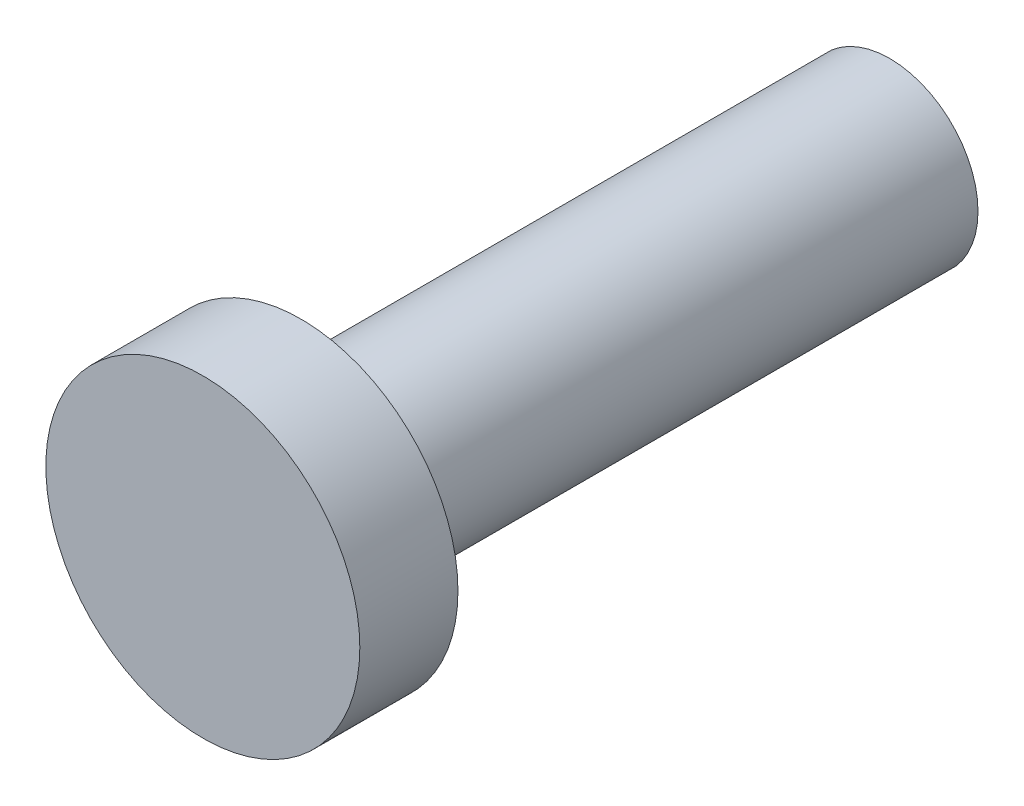
ISO-10303-21;
HEADER;
FILE_DESCRIPTION(('STEP AP214'),'2;1');
FILE_NAME('part.step','',(''),(''),'','','');
FILE_SCHEMA(('AUTOMOTIVE_DESIGN { 1 0 10303 214 1 1 1 1 }'));
ENDSEC;
DATA;
#1=APPLICATION_CONTEXT('core data for automotive mechanical design processes');
#2=APPLICATION_PROTOCOL_DEFINITION('international standard','automotive_design',2000,#1);
#3=PRODUCT_CONTEXT('',#1,'mechanical');
#4=PRODUCT('Part','Part','',(#3));
#5=PRODUCT_RELATED_PRODUCT_CATEGORY('part','',(#4));
#6=PRODUCT_DEFINITION_FORMATION('','',#4);
#7=PRODUCT_DEFINITION_CONTEXT('part definition',#1,'design');
#8=PRODUCT_DEFINITION('design','',#6,#7);
#9=PRODUCT_DEFINITION_SHAPE('','',#8);
#10=(LENGTH_UNIT() NAMED_UNIT(*) SI_UNIT(.MILLI.,.METRE.));
#11=(NAMED_UNIT(*) PLANE_ANGLE_UNIT() SI_UNIT($,.RADIAN.));
#12=(NAMED_UNIT(*) SI_UNIT($,.STERADIAN.) SOLID_ANGLE_UNIT());
#13=UNCERTAINTY_MEASURE_WITH_UNIT(LENGTH_MEASURE(1.E-05),#10,'distance_accuracy_value','');
#14=(GEOMETRIC_REPRESENTATION_CONTEXT(3) GLOBAL_UNCERTAINTY_ASSIGNED_CONTEXT((#13)) GLOBAL_UNIT_ASSIGNED_CONTEXT((#10,
#11,#12)) REPRESENTATION_CONTEXT('',''));
#15=CARTESIAN_POINT('',(0.,0.,0.));
#16=DIRECTION('',(0.,0.,1.));
#17=DIRECTION('',(1.,0.,0.));
#18=AXIS2_PLACEMENT_3D('',#15,#16,#17);
#19=CARTESIAN_POINT('',(0.,0.,30.));
#20=DIRECTION('',(0.,0.,-1.));
#21=DIRECTION('',(-1.,0.,0.));
#22=AXIS2_PLACEMENT_3D('',#19,#20,#21);
#23=CYLINDRICAL_SURFACE('',#22,4.5);
#24=CARTESIAN_POINT('',(0.,0.,30.));
#25=DIRECTION('',(0.,0.,1.));
#26=DIRECTION('',(1.,0.,0.));
#27=AXIS2_PLACEMENT_3D('',#24,#25,#26);
#28=CIRCLE('',#27,4.5);
#29=CARTESIAN_POINT('',(4.5,0.,30.));
#30=VERTEX_POINT('',#29);
#31=EDGE_CURVE('E10',#30,#30,#28,.T.);
#32=ORIENTED_EDGE('',*,*,#31,.F.);
#33=EDGE_LOOP('',(#32));
#34=FACE_BOUND('',#33,.T.);
#35=CARTESIAN_POINT('',(0.,0.,0.));
#36=DIRECTION('',(0.,0.,1.));
#37=DIRECTION('',(1.,0.,0.));
#38=AXIS2_PLACEMENT_3D('',#35,#36,#37);
#39=CIRCLE('',#38,4.5);
#40=CARTESIAN_POINT('',(4.5,0.,0.));
#41=VERTEX_POINT('',#40);
#42=EDGE_CURVE('E40',#41,#41,#39,.T.);
#43=ORIENTED_EDGE('',*,*,#42,.T.);
#44=EDGE_LOOP('',(#43));
#45=FACE_BOUND('',#44,.T.);
#46=ADVANCED_FACE('F37',(#34,#45),#23,.T.);
#47=CARTESIAN_POINT('',(0.,0.,0.));
#48=DIRECTION('',(0.,0.,1.));
#49=DIRECTION('',(1.,0.,0.));
#50=AXIS2_PLACEMENT_3D('',#47,#48,#49);
#51=PLANE('',#50);
#52=ORIENTED_EDGE('',*,*,#42,.F.);
#53=EDGE_LOOP('',(#52));
#54=FACE_BOUND('',#53,.T.);
#55=ADVANCED_FACE('F64',(#54),#51,.F.);
#56=CARTESIAN_POINT('',(0.,0.,35.));
#57=DIRECTION('',(0.,0.,-1.));
#58=DIRECTION('',(-1.,0.,0.));
#59=AXIS2_PLACEMENT_3D('',#56,#57,#58);
#60=CYLINDRICAL_SURFACE('',#59,8.);
#61=CARTESIAN_POINT('',(0.,0.,35.));
#62=DIRECTION('',(0.,0.,1.));
#63=DIRECTION('',(1.,0.,0.));
#64=AXIS2_PLACEMENT_3D('',#61,#62,#63);
#65=CIRCLE('',#64,8.);
#66=CARTESIAN_POINT('',(8.,0.,35.));
#67=VERTEX_POINT('',#66);
#68=EDGE_CURVE('E49',#67,#67,#65,.T.);
#69=ORIENTED_EDGE('',*,*,#68,.F.);
#70=EDGE_LOOP('',(#69));
#71=FACE_BOUND('',#70,.T.);
#72=CARTESIAN_POINT('',(0.,0.,30.));
#73=DIRECTION('',(0.,0.,1.));
#74=DIRECTION('',(1.,0.,0.));
#75=AXIS2_PLACEMENT_3D('',#72,#73,#74);
#76=CIRCLE('',#75,8.);
#77=CARTESIAN_POINT('',(8.,0.,30.));
#78=VERTEX_POINT('',#77);
#79=EDGE_CURVE('E51',#78,#78,#76,.T.);
#80=ORIENTED_EDGE('',*,*,#79,.T.);
#81=EDGE_LOOP('',(#80));
#82=FACE_BOUND('',#81,.T.);
#83=ADVANCED_FACE('F61',(#71,#82),#60,.T.);
#84=CARTESIAN_POINT('',(0.,0.,35.));
#85=DIRECTION('',(0.,0.,1.));
#86=DIRECTION('',(1.,0.,0.));
#87=AXIS2_PLACEMENT_3D('',#84,#85,#86);
#88=PLANE('',#87);
#89=ORIENTED_EDGE('',*,*,#68,.T.);
#90=EDGE_LOOP('',(#89));
#91=FACE_BOUND('',#90,.T.);
#92=ADVANCED_FACE('F59',(#91),#88,.T.);
#93=CARTESIAN_POINT('',(0.,0.,30.));
#94=DIRECTION('',(0.,0.,1.));
#95=DIRECTION('',(1.,0.,0.));
#96=AXIS2_PLACEMENT_3D('',#93,#94,#95);
#97=PLANE('',#96);
#98=ORIENTED_EDGE('',*,*,#31,.T.);
#99=EDGE_LOOP('',(#98));
#100=FACE_BOUND('',#99,.T.);
#101=ORIENTED_EDGE('',*,*,#79,.F.);
#102=EDGE_LOOP('',(#101));
#103=FACE_BOUND('',#102,.T.);
#104=ADVANCED_FACE('F68',(#100,#103),#97,.F.);
#105=CLOSED_SHELL('',(#46,#55,#83,#92,#104));
#106=MANIFOLD_SOLID_BREP('B2',#105);
#107=ADVANCED_BREP_SHAPE_REPRESENTATION('',(#18,#106),#14);
#108=SHAPE_DEFINITION_REPRESENTATION(#9,#107);
ENDSEC;
END-ISO-10303-21;
